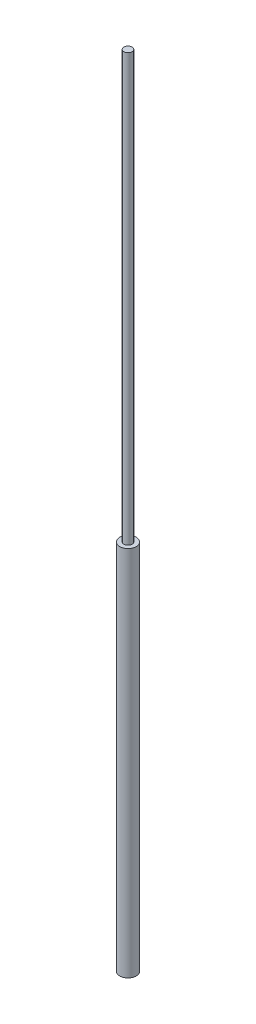
ISO-10303-21;
HEADER;
FILE_DESCRIPTION(('STEP AP214'),'2;1');
FILE_NAME('part.step','',(''),(''),'','','');
FILE_SCHEMA(('AUTOMOTIVE_DESIGN { 1 0 10303 214 1 1 1 1 }'));
ENDSEC;
DATA;
#1=APPLICATION_CONTEXT('core data for automotive mechanical design processes');
#2=APPLICATION_PROTOCOL_DEFINITION('international standard','automotive_design',2000,#1);
#3=PRODUCT_CONTEXT('',#1,'mechanical');
#4=PRODUCT('Part','Part','',(#3));
#5=PRODUCT_RELATED_PRODUCT_CATEGORY('part','',(#4));
#6=PRODUCT_DEFINITION_FORMATION('','',#4);
#7=PRODUCT_DEFINITION_CONTEXT('part definition',#1,'design');
#8=PRODUCT_DEFINITION('design','',#6,#7);
#9=PRODUCT_DEFINITION_SHAPE('','',#8);
#10=(LENGTH_UNIT() NAMED_UNIT(*) SI_UNIT(.MILLI.,.METRE.));
#11=(NAMED_UNIT(*) PLANE_ANGLE_UNIT() SI_UNIT($,.RADIAN.));
#12=(NAMED_UNIT(*) SI_UNIT($,.STERADIAN.) SOLID_ANGLE_UNIT());
#13=UNCERTAINTY_MEASURE_WITH_UNIT(LENGTH_MEASURE(1.E-05),#10,'distance_accuracy_value','');
#14=(GEOMETRIC_REPRESENTATION_CONTEXT(3) GLOBAL_UNCERTAINTY_ASSIGNED_CONTEXT((#13)) GLOBAL_UNIT_ASSIGNED_CONTEXT((#10,
#11,#12)) REPRESENTATION_CONTEXT('',''));
#15=CARTESIAN_POINT('',(0.,0.,0.));
#16=DIRECTION('',(0.,0.,1.));
#17=DIRECTION('',(1.,0.,0.));
#18=AXIS2_PLACEMENT_3D('',#15,#16,#17);
#19=CARTESIAN_POINT('',(0.,34.,0.));
#20=DIRECTION('',(0.,-1.,0.));
#21=DIRECTION('',(0.,0.,-1.));
#22=AXIS2_PLACEMENT_3D('',#19,#20,#21);
#23=CYLINDRICAL_SURFACE('',#22,0.75);
#24=CARTESIAN_POINT('',(0.,34.,0.));
#25=DIRECTION('',(0.,1.,0.));
#26=DIRECTION('',(0.,0.,1.));
#27=AXIS2_PLACEMENT_3D('',#24,#25,#26);
#28=CIRCLE('',#27,0.75);
#29=CARTESIAN_POINT('',(0.,34.,0.75));
#30=VERTEX_POINT('',#29);
#31=EDGE_CURVE('E51',#30,#30,#28,.T.);
#32=ORIENTED_EDGE('',*,*,#31,.F.);
#33=EDGE_LOOP('',(#32));
#34=FACE_BOUND('',#33,.T.);
#35=CARTESIAN_POINT('',(0.,0.,0.));
#36=DIRECTION('',(0.,1.,0.));
#37=DIRECTION('',(0.,0.,1.));
#38=AXIS2_PLACEMENT_3D('',#35,#36,#37);
#39=CIRCLE('',#38,0.75);
#40=CARTESIAN_POINT('',(0.,0.,0.75));
#41=VERTEX_POINT('',#40);
#42=EDGE_CURVE('E46',#41,#41,#39,.T.);
#43=ORIENTED_EDGE('',*,*,#42,.T.);
#44=EDGE_LOOP('',(#43));
#45=FACE_BOUND('',#44,.T.);
#46=ADVANCED_FACE('F43',(#34,#45),#23,.T.);
#47=CARTESIAN_POINT('',(0.,34.,0.));
#48=DIRECTION('',(0.,1.,0.));
#49=DIRECTION('',(0.,0.,1.));
#50=AXIS2_PLACEMENT_3D('',#47,#48,#49);
#51=PLANE('',#50);
#52=CARTESIAN_POINT('',(0.,34.,0.));
#53=DIRECTION('',(0.,1.,0.));
#54=DIRECTION('',(0.,0.,1.));
#55=AXIS2_PLACEMENT_3D('',#52,#53,#54);
#56=CIRCLE('',#55,0.375);
#57=CARTESIAN_POINT('',(0.,34.,0.375));
#58=VERTEX_POINT('',#57);
#59=EDGE_CURVE('E10',#58,#58,#56,.T.);
#60=ORIENTED_EDGE('',*,*,#59,.F.);
#61=EDGE_LOOP('',(#60));
#62=FACE_BOUND('',#61,.T.);
#63=ORIENTED_EDGE('',*,*,#31,.T.);
#64=EDGE_LOOP('',(#63));
#65=FACE_BOUND('',#64,.T.);
#66=ADVANCED_FACE('F71',(#62,#65),#51,.T.);
#67=CARTESIAN_POINT('',(0.,0.,0.));
#68=DIRECTION('',(0.,1.,0.));
#69=DIRECTION('',(0.,0.,1.));
#70=AXIS2_PLACEMENT_3D('',#67,#68,#69);
#71=PLANE('',#70);
#72=ORIENTED_EDGE('',*,*,#42,.F.);
#73=EDGE_LOOP('',(#72));
#74=FACE_BOUND('',#73,.T.);
#75=ADVANCED_FACE('F68',(#74),#71,.F.);
#76=CARTESIAN_POINT('',(0.,73.,0.));
#77=DIRECTION('',(0.,-1.,0.));
#78=DIRECTION('',(0.,0.,-1.));
#79=AXIS2_PLACEMENT_3D('',#76,#77,#78);
#80=CYLINDRICAL_SURFACE('',#79,0.375);
#81=CARTESIAN_POINT('',(0.,73.,0.));
#82=DIRECTION('',(0.,1.,0.));
#83=DIRECTION('',(0.,0.,1.));
#84=AXIS2_PLACEMENT_3D('',#81,#82,#83);
#85=CIRCLE('',#84,0.375);
#86=CARTESIAN_POINT('',(0.,73.,0.375));
#87=VERTEX_POINT('',#86);
#88=EDGE_CURVE('E58',#87,#87,#85,.T.);
#89=ORIENTED_EDGE('',*,*,#88,.F.);
#90=EDGE_LOOP('',(#89));
#91=FACE_BOUND('',#90,.T.);
#92=ORIENTED_EDGE('',*,*,#59,.T.);
#93=EDGE_LOOP('',(#92));
#94=FACE_BOUND('',#93,.T.);
#95=ADVANCED_FACE('F70',(#91,#94),#80,.T.);
#96=CARTESIAN_POINT('',(0.,73.,0.));
#97=DIRECTION('',(0.,1.,0.));
#98=DIRECTION('',(0.,0.,1.));
#99=AXIS2_PLACEMENT_3D('',#96,#97,#98);
#100=PLANE('',#99);
#101=ORIENTED_EDGE('',*,*,#88,.T.);
#102=EDGE_LOOP('',(#101));
#103=FACE_BOUND('',#102,.T.);
#104=ADVANCED_FACE('F77',(#103),#100,.T.);
#105=CLOSED_SHELL('',(#46,#66,#75,#95,#104));
#106=MANIFOLD_SOLID_BREP('B2',#105);
#107=ADVANCED_BREP_SHAPE_REPRESENTATION('',(#18,#106),#14);
#108=SHAPE_DEFINITION_REPRESENTATION(#9,#107);
ENDSEC;
END-ISO-10303-21;
